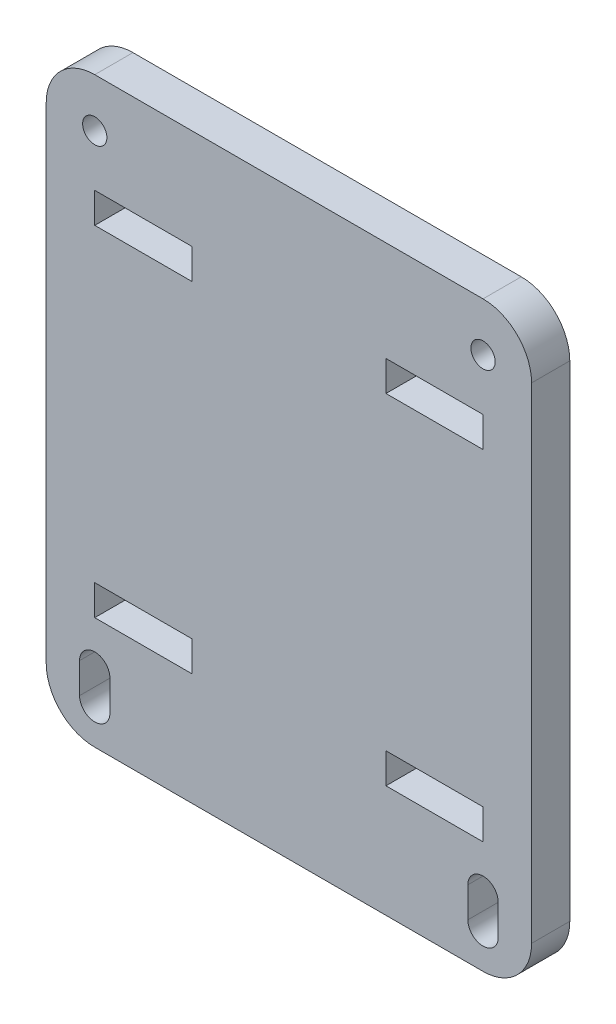
ISO-10303-21;
HEADER;
FILE_DESCRIPTION(('STEP AP214'),'2;1');
FILE_NAME('part.step','',(''),(''),'','','');
FILE_SCHEMA(('AUTOMOTIVE_DESIGN { 1 0 10303 214 1 1 1 1 }'));
ENDSEC;
DATA;
#1=APPLICATION_CONTEXT('core data for automotive mechanical design processes');
#2=APPLICATION_PROTOCOL_DEFINITION('international standard','automotive_design',2000,#1);
#3=PRODUCT_CONTEXT('',#1,'mechanical');
#4=PRODUCT('Part','Part','',(#3));
#5=PRODUCT_RELATED_PRODUCT_CATEGORY('part','',(#4));
#6=PRODUCT_DEFINITION_FORMATION('','',#4);
#7=PRODUCT_DEFINITION_CONTEXT('part definition',#1,'design');
#8=PRODUCT_DEFINITION('design','',#6,#7);
#9=PRODUCT_DEFINITION_SHAPE('','',#8);
#10=(LENGTH_UNIT() NAMED_UNIT(*) SI_UNIT(.MILLI.,.METRE.));
#11=(NAMED_UNIT(*) PLANE_ANGLE_UNIT() SI_UNIT($,.RADIAN.));
#12=(NAMED_UNIT(*) SI_UNIT($,.STERADIAN.) SOLID_ANGLE_UNIT());
#13=UNCERTAINTY_MEASURE_WITH_UNIT(LENGTH_MEASURE(1.E-05),#10,'distance_accuracy_value','');
#14=(GEOMETRIC_REPRESENTATION_CONTEXT(3) GLOBAL_UNCERTAINTY_ASSIGNED_CONTEXT((#13)) GLOBAL_UNIT_ASSIGNED_CONTEXT((#10,
#11,#12)) REPRESENTATION_CONTEXT('',''));
#15=CARTESIAN_POINT('',(0.,0.,0.));
#16=DIRECTION('',(0.,0.,1.));
#17=DIRECTION('',(1.,0.,0.));
#18=AXIS2_PLACEMENT_3D('',#15,#16,#17);
#19=CARTESIAN_POINT('',(-127.,152.4,10.));
#20=DIRECTION('',(1.,0.,0.));
#21=DIRECTION('',(0.,1.,0.));
#22=AXIS2_PLACEMENT_3D('',#19,#20,#21);
#23=PLANE('',#22);
#24=DIRECTION('',(0.,-1.,0.));
#25=VECTOR('',#24,1.);
#26=CARTESIAN_POINT('',(-127.,152.4,0.));
#27=LINE('',#26,#25);
#28=CARTESIAN_POINT('',(-127.,139.7,0.));
#29=VERTEX_POINT('',#28);
#30=CARTESIAN_POINT('',(-127.,12.7,0.));
#31=VERTEX_POINT('',#30);
#32=EDGE_CURVE('E387',#29,#31,#27,.T.);
#33=ORIENTED_EDGE('',*,*,#32,.T.);
#34=DIRECTION('',(0.,0.,-1.));
#35=VECTOR('',#34,1.);
#36=CARTESIAN_POINT('',(-127.,12.7,10.));
#37=LINE('',#36,#35);
#38=CARTESIAN_POINT('',(-127.,12.7,10.));
#39=VERTEX_POINT('',#38);
#40=EDGE_CURVE('E41',#31,#39,#37,.F.);
#41=ORIENTED_EDGE('',*,*,#40,.T.);
#42=DIRECTION('',(0.,-1.,0.));
#43=VECTOR('',#42,1.);
#44=CARTESIAN_POINT('',(-127.,152.4,10.));
#45=LINE('',#44,#43);
#46=CARTESIAN_POINT('',(-127.,139.7,10.));
#47=VERTEX_POINT('',#46);
#48=EDGE_CURVE('E394',#47,#39,#45,.T.);
#49=ORIENTED_EDGE('',*,*,#48,.F.);
#50=DIRECTION('',(0.,0.,-1.));
#51=VECTOR('',#50,1.);
#52=CARTESIAN_POINT('',(-127.,139.7,10.));
#53=LINE('',#52,#51);
#54=EDGE_CURVE('E506',#47,#29,#53,.T.);
#55=ORIENTED_EDGE('',*,*,#54,.T.);
#56=EDGE_LOOP('',(#33,#41,#49,#55));
#57=FACE_BOUND('',#56,.T.);
#58=ADVANCED_FACE('F33',(#57),#23,.F.);
#59=CARTESIAN_POINT('',(-127.,0.,10.));
#60=DIRECTION('',(0.,1.,0.));
#61=DIRECTION('',(0.,0.,1.));
#62=AXIS2_PLACEMENT_3D('',#59,#60,#61);
#63=PLANE('',#62);
#64=DIRECTION('',(1.,0.,0.));
#65=VECTOR('',#64,1.);
#66=CARTESIAN_POINT('',(-127.,0.,0.));
#67=LINE('',#66,#65);
#68=CARTESIAN_POINT('',(-114.3,0.,0.));
#69=VERTEX_POINT('',#68);
#70=CARTESIAN_POINT('',(-12.7,0.,0.));
#71=VERTEX_POINT('',#70);
#72=EDGE_CURVE('E406',#69,#71,#67,.T.);
#73=ORIENTED_EDGE('',*,*,#72,.T.);
#74=DIRECTION('',(0.,0.,-1.));
#75=VECTOR('',#74,1.);
#76=CARTESIAN_POINT('',(-12.7,0.,10.));
#77=LINE('',#76,#75);
#78=CARTESIAN_POINT('',(-12.7,0.,10.));
#79=VERTEX_POINT('',#78);
#80=EDGE_CURVE('E499',#71,#79,#77,.F.);
#81=ORIENTED_EDGE('',*,*,#80,.T.);
#82=DIRECTION('',(1.,0.,0.));
#83=VECTOR('',#82,1.);
#84=CARTESIAN_POINT('',(-127.,0.,10.));
#85=LINE('',#84,#83);
#86=CARTESIAN_POINT('',(-114.3,0.,10.));
#87=VERTEX_POINT('',#86);
#88=EDGE_CURVE('E396',#87,#79,#85,.T.);
#89=ORIENTED_EDGE('',*,*,#88,.F.);
#90=DIRECTION('',(0.,0.,-1.));
#91=VECTOR('',#90,1.);
#92=CARTESIAN_POINT('',(-114.3,0.,10.));
#93=LINE('',#92,#91);
#94=EDGE_CURVE('E496',#87,#69,#93,.T.);
#95=ORIENTED_EDGE('',*,*,#94,.T.);
#96=EDGE_LOOP('',(#73,#81,#89,#95));
#97=FACE_BOUND('',#96,.T.);
#98=ADVANCED_FACE('F522',(#97),#63,.F.);
#99=CARTESIAN_POINT('',(0.,152.4,10.));
#100=DIRECTION('',(-1.,0.,0.));
#101=DIRECTION('',(0.,-1.,0.));
#102=AXIS2_PLACEMENT_3D('',#99,#100,#101);
#103=PLANE('',#102);
#104=DIRECTION('',(0.,1.,0.));
#105=VECTOR('',#104,1.);
#106=CARTESIAN_POINT('',(0.,152.4,10.));
#107=LINE('',#106,#105);
#108=CARTESIAN_POINT('',(0.,12.7,10.));
#109=VERTEX_POINT('',#108);
#110=CARTESIAN_POINT('',(0.,139.7,10.));
#111=VERTEX_POINT('',#110);
#112=EDGE_CURVE('E400',#109,#111,#107,.T.);
#113=ORIENTED_EDGE('',*,*,#112,.F.);
#114=DIRECTION('',(0.,0.,-1.));
#115=VECTOR('',#114,1.);
#116=CARTESIAN_POINT('',(0.,12.7,10.));
#117=LINE('',#116,#115);
#118=CARTESIAN_POINT('',(0.,12.7,0.));
#119=VERTEX_POINT('',#118);
#120=EDGE_CURVE('E487',#109,#119,#117,.T.);
#121=ORIENTED_EDGE('',*,*,#120,.T.);
#122=DIRECTION('',(0.,1.,0.));
#123=VECTOR('',#122,1.);
#124=CARTESIAN_POINT('',(0.,152.4,0.));
#125=LINE('',#124,#123);
#126=CARTESIAN_POINT('',(0.,139.7,0.));
#127=VERTEX_POINT('',#126);
#128=EDGE_CURVE('E409',#119,#127,#125,.T.);
#129=ORIENTED_EDGE('',*,*,#128,.T.);
#130=DIRECTION('',(0.,0.,-1.));
#131=VECTOR('',#130,1.);
#132=CARTESIAN_POINT('',(0.,139.7,10.));
#133=LINE('',#132,#131);
#134=EDGE_CURVE('E482',#127,#111,#133,.F.);
#135=ORIENTED_EDGE('',*,*,#134,.T.);
#136=EDGE_LOOP('',(#113,#121,#129,#135));
#137=FACE_BOUND('',#136,.T.);
#138=ADVANCED_FACE('F532',(#137),#103,.F.);
#139=CARTESIAN_POINT('',(-127.,152.4,10.));
#140=DIRECTION('',(0.,-1.,0.));
#141=DIRECTION('',(0.,0.,-1.));
#142=AXIS2_PLACEMENT_3D('',#139,#140,#141);
#143=PLANE('',#142);
#144=DIRECTION('',(-1.,0.,0.));
#145=VECTOR('',#144,1.);
#146=CARTESIAN_POINT('',(-127.,152.4,0.));
#147=LINE('',#146,#145);
#148=CARTESIAN_POINT('',(-12.7,152.4,0.));
#149=VERTEX_POINT('',#148);
#150=CARTESIAN_POINT('',(-114.3,152.4,0.));
#151=VERTEX_POINT('',#150);
#152=EDGE_CURVE('E397',#149,#151,#147,.T.);
#153=ORIENTED_EDGE('',*,*,#152,.T.);
#154=DIRECTION('',(0.,0.,-1.));
#155=VECTOR('',#154,1.);
#156=CARTESIAN_POINT('',(-114.3,152.4,10.));
#157=LINE('',#156,#155);
#158=CARTESIAN_POINT('',(-114.3,152.4,10.));
#159=VERTEX_POINT('',#158);
#160=EDGE_CURVE('E11',#151,#159,#157,.F.);
#161=ORIENTED_EDGE('',*,*,#160,.T.);
#162=DIRECTION('',(-1.,0.,0.));
#163=VECTOR('',#162,1.);
#164=CARTESIAN_POINT('',(-127.,152.4,10.));
#165=LINE('',#164,#163);
#166=CARTESIAN_POINT('',(-12.7,152.4,10.));
#167=VERTEX_POINT('',#166);
#168=EDGE_CURVE('E402',#167,#159,#165,.T.);
#169=ORIENTED_EDGE('',*,*,#168,.F.);
#170=DIRECTION('',(0.,0.,-1.));
#171=VECTOR('',#170,1.);
#172=CARTESIAN_POINT('',(-12.7,152.4,10.));
#173=LINE('',#172,#171);
#174=EDGE_CURVE('E476',#167,#149,#173,.T.);
#175=ORIENTED_EDGE('',*,*,#174,.T.);
#176=EDGE_LOOP('',(#153,#161,#169,#175));
#177=FACE_BOUND('',#176,.T.);
#178=ADVANCED_FACE('F540',(#177),#143,.F.);
#179=CARTESIAN_POINT('',(-127.,0.,10.));
#180=DIRECTION('',(0.,0.,1.));
#181=DIRECTION('',(1.,0.,0.));
#182=AXIS2_PLACEMENT_3D('',#179,#180,#181);
#183=PLANE('',#182);
#184=CARTESIAN_POINT('',(-12.7,17.6403,10.));
#185=DIRECTION('',(0.,0.,1.));
#186=DIRECTION('',(1.,0.,0.));
#187=AXIS2_PLACEMENT_3D('',#184,#185,#186);
#188=CIRCLE('',#187,3.97002);
#189=CARTESIAN_POINT('',(-8.72998000000003,17.6403,10.));
#190=VERTEX_POINT('',#189);
#191=CARTESIAN_POINT('',(-16.67002,17.6403,10.));
#192=VERTEX_POINT('',#191);
#193=EDGE_CURVE('E249',#190,#192,#188,.T.);
#194=ORIENTED_EDGE('',*,*,#193,.F.);
#195=DIRECTION('',(0.,1.,0.));
#196=VECTOR('',#195,1.);
#197=CARTESIAN_POINT('',(-8.72998000000003,17.6403,10.));
#198=LINE('',#197,#196);
#199=CARTESIAN_POINT('',(-8.72998000000003,9.7028,10.));
#200=VERTEX_POINT('',#199);
#201=EDGE_CURVE('E267',#200,#190,#198,.T.);
#202=ORIENTED_EDGE('',*,*,#201,.F.);
#203=CARTESIAN_POINT('',(-12.7,9.7028,10.));
#204=DIRECTION('',(0.,0.,1.));
#205=DIRECTION('',(1.,0.,0.));
#206=AXIS2_PLACEMENT_3D('',#203,#204,#205);
#207=CIRCLE('',#206,3.97002);
#208=CARTESIAN_POINT('',(-16.67002,9.7028,10.));
#209=VERTEX_POINT('',#208);
#210=EDGE_CURVE('E270',#209,#200,#207,.T.);
#211=ORIENTED_EDGE('',*,*,#210,.F.);
#212=DIRECTION('',(0.,-1.,0.));
#213=VECTOR('',#212,1.);
#214=CARTESIAN_POINT('',(-16.67002,17.6403,10.));
#215=LINE('',#214,#213);
#216=EDGE_CURVE('E276',#192,#209,#215,.T.);
#217=ORIENTED_EDGE('',*,*,#216,.F.);
#218=EDGE_LOOP('',(#194,#202,#211,#217));
#219=FACE_BOUND('',#218,.T.);
#220=CARTESIAN_POINT('',(-114.3,17.6403,10.));
#221=DIRECTION('',(0.,0.,1.));
#222=DIRECTION('',(1.,0.,0.));
#223=AXIS2_PLACEMENT_3D('',#220,#221,#222);
#224=CIRCLE('',#223,3.97002);
#225=CARTESIAN_POINT('',(-110.32998,17.6403,10.));
#226=VERTEX_POINT('',#225);
#227=CARTESIAN_POINT('',(-118.27002,17.6403,10.));
#228=VERTEX_POINT('',#227);
#229=EDGE_CURVE('E282',#226,#228,#224,.T.);
#230=ORIENTED_EDGE('',*,*,#229,.F.);
#231=DIRECTION('',(0.,1.,0.));
#232=VECTOR('',#231,1.);
#233=CARTESIAN_POINT('',(-110.32998,17.6403,10.));
#234=LINE('',#233,#232);
#235=CARTESIAN_POINT('',(-110.32998,9.7028,10.));
#236=VERTEX_POINT('',#235);
#237=EDGE_CURVE('E290',#236,#226,#234,.T.);
#238=ORIENTED_EDGE('',*,*,#237,.F.);
#239=CARTESIAN_POINT('',(-114.3,9.7028,10.));
#240=DIRECTION('',(0.,0.,1.));
#241=DIRECTION('',(1.,0.,0.));
#242=AXIS2_PLACEMENT_3D('',#239,#240,#241);
#243=CIRCLE('',#242,3.97002);
#244=CARTESIAN_POINT('',(-118.27002,9.7028,10.));
#245=VERTEX_POINT('',#244);
#246=EDGE_CURVE('E304',#245,#236,#243,.T.);
#247=ORIENTED_EDGE('',*,*,#246,.F.);
#248=DIRECTION('',(0.,-1.,0.));
#249=VECTOR('',#248,1.);
#250=CARTESIAN_POINT('',(-118.27002,17.6403,10.));
#251=LINE('',#250,#249);
#252=EDGE_CURVE('E301',#228,#245,#251,.T.);
#253=ORIENTED_EDGE('',*,*,#252,.F.);
#254=EDGE_LOOP('',(#230,#238,#247,#253));
#255=FACE_BOUND('',#254,.T.);
#256=CARTESIAN_POINT('',(-12.7,139.7,10.));
#257=DIRECTION('',(0.,0.,1.));
#258=DIRECTION('',(1.,0.,0.));
#259=AXIS2_PLACEMENT_3D('',#256,#257,#258);
#260=CIRCLE('',#259,3.175);
#261=CARTESIAN_POINT('',(-9.52500000000003,139.7,10.));
#262=VERTEX_POINT('',#261);
#263=EDGE_CURVE('E311',#262,#262,#260,.T.);
#264=ORIENTED_EDGE('',*,*,#263,.F.);
#265=EDGE_LOOP('',(#264));
#266=FACE_BOUND('',#265,.T.);
#267=CARTESIAN_POINT('',(-114.3,139.7,10.));
#268=DIRECTION('',(0.,0.,1.));
#269=DIRECTION('',(1.,0.,0.));
#270=AXIS2_PLACEMENT_3D('',#267,#268,#269);
#271=CIRCLE('',#270,3.175);
#272=CARTESIAN_POINT('',(-111.125,139.7,10.));
#273=VERTEX_POINT('',#272);
#274=EDGE_CURVE('E321',#273,#273,#271,.T.);
#275=ORIENTED_EDGE('',*,*,#274,.F.);
#276=EDGE_LOOP('',(#275));
#277=FACE_BOUND('',#276,.T.);
#278=DIRECTION('',(0.,-1.,0.));
#279=VECTOR('',#278,1.);
#280=CARTESIAN_POINT('',(-38.1,126.19228,10.));
#281=LINE('',#280,#279);
#282=CARTESIAN_POINT('',(-38.1,126.19228,10.));
#283=VERTEX_POINT('',#282);
#284=CARTESIAN_POINT('',(-38.1,118.25478,10.));
#285=VERTEX_POINT('',#284);
#286=EDGE_CURVE('E356',#283,#285,#281,.T.);
#287=ORIENTED_EDGE('',*,*,#286,.F.);
#288=DIRECTION('',(-1.,0.,0.));
#289=VECTOR('',#288,1.);
#290=CARTESIAN_POINT('',(-38.1,126.19228,10.));
#291=LINE('',#290,#289);
#292=CARTESIAN_POINT('',(-12.7,126.19228,10.));
#293=VERTEX_POINT('',#292);
#294=EDGE_CURVE('E348',#293,#283,#291,.T.);
#295=ORIENTED_EDGE('',*,*,#294,.F.);
#296=DIRECTION('',(0.,1.,0.));
#297=VECTOR('',#296,1.);
#298=CARTESIAN_POINT('',(-12.7,126.19228,10.));
#299=LINE('',#298,#297);
#300=CARTESIAN_POINT('',(-12.7,118.25478,10.));
#301=VERTEX_POINT('',#300);
#302=EDGE_CURVE('E340',#301,#293,#299,.T.);
#303=ORIENTED_EDGE('',*,*,#302,.F.);
#304=DIRECTION('',(1.,0.,0.));
#305=VECTOR('',#304,1.);
#306=CARTESIAN_POINT('',(-38.1,118.25478,10.));
#307=LINE('',#306,#305);
#308=EDGE_CURVE('E327',#285,#301,#307,.T.);
#309=ORIENTED_EDGE('',*,*,#308,.F.);
#310=EDGE_LOOP('',(#287,#295,#303,#309));
#311=FACE_BOUND('',#310,.T.);
#312=DIRECTION('',(0.,-1.,0.));
#313=VECTOR('',#312,1.);
#314=CARTESIAN_POINT('',(-114.3,126.19228,10.));
#315=LINE('',#314,#313);
#316=CARTESIAN_POINT('',(-114.3,126.19228,10.));
#317=VERTEX_POINT('',#316);
#318=CARTESIAN_POINT('',(-114.3,118.25478,10.));
#319=VERTEX_POINT('',#318);
#320=EDGE_CURVE('E361',#317,#319,#315,.T.);
#321=ORIENTED_EDGE('',*,*,#320,.F.);
#322=DIRECTION('',(-1.,0.,0.));
#323=VECTOR('',#322,1.);
#324=CARTESIAN_POINT('',(-114.3,126.19228,10.));
#325=LINE('',#324,#323);
#326=CARTESIAN_POINT('',(-88.9,126.19228,10.));
#327=VERTEX_POINT('',#326);
#328=EDGE_CURVE('E366',#327,#317,#325,.T.);
#329=ORIENTED_EDGE('',*,*,#328,.F.);
#330=DIRECTION('',(0.,1.,0.));
#331=VECTOR('',#330,1.);
#332=CARTESIAN_POINT('',(-88.9,126.19228,10.));
#333=LINE('',#332,#331);
#334=CARTESIAN_POINT('',(-88.9,118.25478,10.));
#335=VERTEX_POINT('',#334);
#336=EDGE_CURVE('E380',#335,#327,#333,.T.);
#337=ORIENTED_EDGE('',*,*,#336,.F.);
#338=DIRECTION('',(1.,0.,0.));
#339=VECTOR('',#338,1.);
#340=CARTESIAN_POINT('',(-114.3,118.25478,10.));
#341=LINE('',#340,#339);
#342=EDGE_CURVE('E377',#319,#335,#341,.T.);
#343=ORIENTED_EDGE('',*,*,#342,.F.);
#344=EDGE_LOOP('',(#321,#329,#337,#343));
#345=FACE_BOUND('',#344,.T.);
#346=ORIENTED_EDGE('',*,*,#88,.T.);
#347=CARTESIAN_POINT('',(-12.7,12.7,10.));
#348=DIRECTION('',(0.,0.,1.));
#349=DIRECTION('',(1.,0.,0.));
#350=AXIS2_PLACEMENT_3D('',#347,#348,#349);
#351=CIRCLE('',#350,12.7);
#352=EDGE_CURVE('E504',#79,#109,#351,.T.);
#353=ORIENTED_EDGE('',*,*,#352,.T.);
#354=ORIENTED_EDGE('',*,*,#112,.T.);
#355=CARTESIAN_POINT('',(-12.7,139.7,10.));
#356=DIRECTION('',(0.,0.,1.));
#357=DIRECTION('',(1.,0.,0.));
#358=AXIS2_PLACEMENT_3D('',#355,#356,#357);
#359=CIRCLE('',#358,12.7);
#360=EDGE_CURVE('E485',#111,#167,#359,.T.);
#361=ORIENTED_EDGE('',*,*,#360,.T.);
#362=ORIENTED_EDGE('',*,*,#168,.T.);
#363=CARTESIAN_POINT('',(-114.3,139.7,10.));
#364=DIRECTION('',(0.,0.,1.));
#365=DIRECTION('',(1.,0.,0.));
#366=AXIS2_PLACEMENT_3D('',#363,#364,#365);
#367=CIRCLE('',#366,12.7);
#368=EDGE_CURVE('E54',#159,#47,#367,.T.);
#369=ORIENTED_EDGE('',*,*,#368,.T.);
#370=ORIENTED_EDGE('',*,*,#48,.T.);
#371=CARTESIAN_POINT('',(-114.3,12.7,10.));
#372=DIRECTION('',(0.,0.,1.));
#373=DIRECTION('',(1.,0.,0.));
#374=AXIS2_PLACEMENT_3D('',#371,#372,#373);
#375=CIRCLE('',#374,12.7);
#376=EDGE_CURVE('E502',#39,#87,#375,.T.);
#377=ORIENTED_EDGE('',*,*,#376,.T.);
#378=EDGE_LOOP('',(#346,#353,#354,#361,#362,#369,#370,#377));
#379=FACE_BOUND('',#378,.T.);
#380=DIRECTION('',(0.,-1.,0.));
#381=VECTOR('',#380,1.);
#382=CARTESIAN_POINT('',(-114.3,37.29228,10.));
#383=LINE('',#382,#381);
#384=CARTESIAN_POINT('',(-114.3,37.29228,10.));
#385=VERTEX_POINT('',#384);
#386=CARTESIAN_POINT('',(-114.3,29.35478,10.));
#387=VERTEX_POINT('',#386);
#388=EDGE_CURVE('E404',#385,#387,#383,.T.);
#389=ORIENTED_EDGE('',*,*,#388,.F.);
#390=DIRECTION('',(-1.,0.,0.));
#391=VECTOR('',#390,1.);
#392=CARTESIAN_POINT('',(-114.3,37.29228,10.));
#393=LINE('',#392,#391);
#394=CARTESIAN_POINT('',(-88.9,37.29228,10.));
#395=VERTEX_POINT('',#394);
#396=EDGE_CURVE('E414',#395,#385,#393,.T.);
#397=ORIENTED_EDGE('',*,*,#396,.F.);
#398=DIRECTION('',(0.,1.,0.));
#399=VECTOR('',#398,1.);
#400=CARTESIAN_POINT('',(-88.9,37.29228,10.));
#401=LINE('',#400,#399);
#402=CARTESIAN_POINT('',(-88.9,29.35478,10.));
#403=VERTEX_POINT('',#402);
#404=EDGE_CURVE('E417',#403,#395,#401,.T.);
#405=ORIENTED_EDGE('',*,*,#404,.F.);
#406=DIRECTION('',(1.,0.,0.));
#407=VECTOR('',#406,1.);
#408=CARTESIAN_POINT('',(-114.3,29.35478,10.));
#409=LINE('',#408,#407);
#410=EDGE_CURVE('E420',#387,#403,#409,.T.);
#411=ORIENTED_EDGE('',*,*,#410,.F.);
#412=EDGE_LOOP('',(#389,#397,#405,#411));
#413=FACE_BOUND('',#412,.T.);
#414=DIRECTION('',(0.,-1.,0.));
#415=VECTOR('',#414,1.);
#416=CARTESIAN_POINT('',(-38.1,37.29228,10.));
#417=LINE('',#416,#415);
#418=CARTESIAN_POINT('',(-38.1,37.29228,10.));
#419=VERTEX_POINT('',#418);
#420=CARTESIAN_POINT('',(-38.1,29.35478,10.));
#421=VERTEX_POINT('',#420);
#422=EDGE_CURVE('E444',#419,#421,#417,.T.);
#423=ORIENTED_EDGE('',*,*,#422,.F.);
#424=DIRECTION('',(-1.,0.,0.));
#425=VECTOR('',#424,1.);
#426=CARTESIAN_POINT('',(-38.1,37.29228,10.));
#427=LINE('',#426,#425);
#428=CARTESIAN_POINT('',(-12.7,37.29228,10.));
#429=VERTEX_POINT('',#428);
#430=EDGE_CURVE('E446',#429,#419,#427,.T.);
#431=ORIENTED_EDGE('',*,*,#430,.F.);
#432=DIRECTION('',(0.,1.,0.));
#433=VECTOR('',#432,1.);
#434=CARTESIAN_POINT('',(-12.7,37.29228,10.));
#435=LINE('',#434,#433);
#436=CARTESIAN_POINT('',(-12.7,29.35478,10.));
#437=VERTEX_POINT('',#436);
#438=EDGE_CURVE('E449',#437,#429,#435,.T.);
#439=ORIENTED_EDGE('',*,*,#438,.F.);
#440=DIRECTION('',(1.,0.,0.));
#441=VECTOR('',#440,1.);
#442=CARTESIAN_POINT('',(-38.1,29.35478,10.));
#443=LINE('',#442,#441);
#444=EDGE_CURVE('E452',#421,#437,#443,.T.);
#445=ORIENTED_EDGE('',*,*,#444,.F.);
#446=EDGE_LOOP('',(#423,#431,#439,#445));
#447=FACE_BOUND('',#446,.T.);
#448=ADVANCED_FACE('F525',(#219,#255,#266,#277,#311,#345,#379,#413,#447),#183,.T.);
#449=CARTESIAN_POINT('',(-127.,0.,0.));
#450=DIRECTION('',(0.,0.,1.));
#451=DIRECTION('',(1.,0.,0.));
#452=AXIS2_PLACEMENT_3D('',#449,#450,#451);
#453=PLANE('',#452);
#454=DIRECTION('',(0.,1.,0.));
#455=VECTOR('',#454,1.);
#456=CARTESIAN_POINT('',(-8.72998000000003,17.6403,0.));
#457=LINE('',#456,#455);
#458=CARTESIAN_POINT('',(-8.72998000000003,9.7028,0.));
#459=VERTEX_POINT('',#458);
#460=CARTESIAN_POINT('',(-8.72998000000003,17.6403,0.));
#461=VERTEX_POINT('',#460);
#462=EDGE_CURVE('E254',#459,#461,#457,.T.);
#463=ORIENTED_EDGE('',*,*,#462,.T.);
#464=CARTESIAN_POINT('',(-12.7,17.6403,0.));
#465=DIRECTION('',(0.,0.,1.));
#466=DIRECTION('',(1.,0.,0.));
#467=AXIS2_PLACEMENT_3D('',#464,#465,#466);
#468=CIRCLE('',#467,3.97002);
#469=CARTESIAN_POINT('',(-16.67002,17.6403,0.));
#470=VERTEX_POINT('',#469);
#471=EDGE_CURVE('E246',#461,#470,#468,.T.);
#472=ORIENTED_EDGE('',*,*,#471,.T.);
#473=DIRECTION('',(0.,-1.,0.));
#474=VECTOR('',#473,1.);
#475=CARTESIAN_POINT('',(-16.67002,17.6403,0.));
#476=LINE('',#475,#474);
#477=CARTESIAN_POINT('',(-16.67002,9.7028,0.));
#478=VERTEX_POINT('',#477);
#479=EDGE_CURVE('E258',#470,#478,#476,.T.);
#480=ORIENTED_EDGE('',*,*,#479,.T.);
#481=CARTESIAN_POINT('',(-12.7,9.7028,0.));
#482=DIRECTION('',(0.,0.,1.));
#483=DIRECTION('',(1.,0.,0.));
#484=AXIS2_PLACEMENT_3D('',#481,#482,#483);
#485=CIRCLE('',#484,3.97002);
#486=EDGE_CURVE('E262',#478,#459,#485,.T.);
#487=ORIENTED_EDGE('',*,*,#486,.T.);
#488=EDGE_LOOP('',(#463,#472,#480,#487));
#489=FACE_BOUND('',#488,.T.);
#490=DIRECTION('',(0.,1.,0.));
#491=VECTOR('',#490,1.);
#492=CARTESIAN_POINT('',(-110.32998,17.6403,0.));
#493=LINE('',#492,#491);
#494=CARTESIAN_POINT('',(-110.32998,9.7028,0.));
#495=VERTEX_POINT('',#494);
#496=CARTESIAN_POINT('',(-110.32998,17.6403,0.));
#497=VERTEX_POINT('',#496);
#498=EDGE_CURVE('E296',#495,#497,#493,.T.);
#499=ORIENTED_EDGE('',*,*,#498,.T.);
#500=CARTESIAN_POINT('',(-114.3,17.6403,0.));
#501=DIRECTION('',(0.,0.,1.));
#502=DIRECTION('',(1.,0.,0.));
#503=AXIS2_PLACEMENT_3D('',#500,#501,#502);
#504=CIRCLE('',#503,3.97002);
#505=CARTESIAN_POINT('',(-118.27002,17.6403,0.));
#506=VERTEX_POINT('',#505);
#507=EDGE_CURVE('E286',#497,#506,#504,.T.);
#508=ORIENTED_EDGE('',*,*,#507,.T.);
#509=DIRECTION('',(0.,-1.,0.));
#510=VECTOR('',#509,1.);
#511=CARTESIAN_POINT('',(-118.27002,17.6403,0.));
#512=LINE('',#511,#510);
#513=CARTESIAN_POINT('',(-118.27002,9.7028,0.));
#514=VERTEX_POINT('',#513);
#515=EDGE_CURVE('E289',#506,#514,#512,.T.);
#516=ORIENTED_EDGE('',*,*,#515,.T.);
#517=CARTESIAN_POINT('',(-114.3,9.7028,0.));
#518=DIRECTION('',(0.,0.,1.));
#519=DIRECTION('',(1.,0.,0.));
#520=AXIS2_PLACEMENT_3D('',#517,#518,#519);
#521=CIRCLE('',#520,3.97002);
#522=EDGE_CURVE('E293',#514,#495,#521,.T.);
#523=ORIENTED_EDGE('',*,*,#522,.T.);
#524=EDGE_LOOP('',(#499,#508,#516,#523));
#525=FACE_BOUND('',#524,.T.);
#526=CARTESIAN_POINT('',(-12.7,139.7,0.));
#527=DIRECTION('',(0.,0.,1.));
#528=DIRECTION('',(1.,0.,0.));
#529=AXIS2_PLACEMENT_3D('',#526,#527,#528);
#530=CIRCLE('',#529,3.175);
#531=CARTESIAN_POINT('',(-9.52500000000003,139.7,0.));
#532=VERTEX_POINT('',#531);
#533=EDGE_CURVE('E318',#532,#532,#530,.T.);
#534=ORIENTED_EDGE('',*,*,#533,.T.);
#535=EDGE_LOOP('',(#534));
#536=FACE_BOUND('',#535,.T.);
#537=CARTESIAN_POINT('',(-114.3,139.7,0.));
#538=DIRECTION('',(0.,0.,1.));
#539=DIRECTION('',(1.,0.,0.));
#540=AXIS2_PLACEMENT_3D('',#537,#538,#539);
#541=CIRCLE('',#540,3.175);
#542=CARTESIAN_POINT('',(-111.125,139.7,0.));
#543=VERTEX_POINT('',#542);
#544=EDGE_CURVE('E324',#543,#543,#541,.T.);
#545=ORIENTED_EDGE('',*,*,#544,.T.);
#546=EDGE_LOOP('',(#545));
#547=FACE_BOUND('',#546,.T.);
#548=DIRECTION('',(-1.,0.,0.));
#549=VECTOR('',#548,1.);
#550=CARTESIAN_POINT('',(-38.1,126.19228,0.));
#551=LINE('',#550,#549);
#552=CARTESIAN_POINT('',(-12.7,126.19228,0.));
#553=VERTEX_POINT('',#552);
#554=CARTESIAN_POINT('',(-38.1,126.19228,0.));
#555=VERTEX_POINT('',#554);
#556=EDGE_CURVE('E353',#553,#555,#551,.T.);
#557=ORIENTED_EDGE('',*,*,#556,.T.);
#558=DIRECTION('',(0.,-1.,0.));
#559=VECTOR('',#558,1.);
#560=CARTESIAN_POINT('',(-38.1,126.19228,0.));
#561=LINE('',#560,#559);
#562=CARTESIAN_POINT('',(-38.1,118.25478,0.));
#563=VERTEX_POINT('',#562);
#564=EDGE_CURVE('E358',#555,#563,#561,.T.);
#565=ORIENTED_EDGE('',*,*,#564,.T.);
#566=DIRECTION('',(1.,0.,0.));
#567=VECTOR('',#566,1.);
#568=CARTESIAN_POINT('',(-38.1,118.25478,0.));
#569=LINE('',#568,#567);
#570=CARTESIAN_POINT('',(-12.7,118.25478,0.));
#571=VERTEX_POINT('',#570);
#572=EDGE_CURVE('E331',#563,#571,#569,.T.);
#573=ORIENTED_EDGE('',*,*,#572,.T.);
#574=DIRECTION('',(0.,1.,0.));
#575=VECTOR('',#574,1.);
#576=CARTESIAN_POINT('',(-12.7,126.19228,0.));
#577=LINE('',#576,#575);
#578=EDGE_CURVE('E345',#571,#553,#577,.T.);
#579=ORIENTED_EDGE('',*,*,#578,.T.);
#580=EDGE_LOOP('',(#557,#565,#573,#579));
#581=FACE_BOUND('',#580,.T.);
#582=DIRECTION('',(-1.,0.,0.));
#583=VECTOR('',#582,1.);
#584=CARTESIAN_POINT('',(-114.3,126.19228,0.));
#585=LINE('',#584,#583);
#586=CARTESIAN_POINT('',(-88.9,126.19228,0.));
#587=VERTEX_POINT('',#586);
#588=CARTESIAN_POINT('',(-114.3,126.19228,0.));
#589=VERTEX_POINT('',#588);
#590=EDGE_CURVE('E372',#587,#589,#585,.T.);
#591=ORIENTED_EDGE('',*,*,#590,.T.);
#592=DIRECTION('',(0.,-1.,0.));
#593=VECTOR('',#592,1.);
#594=CARTESIAN_POINT('',(-114.3,126.19228,0.));
#595=LINE('',#594,#593);
#596=CARTESIAN_POINT('',(-114.3,118.25478,0.));
#597=VERTEX_POINT('',#596);
#598=EDGE_CURVE('E362',#589,#597,#595,.T.);
#599=ORIENTED_EDGE('',*,*,#598,.T.);
#600=DIRECTION('',(1.,0.,0.));
#601=VECTOR('',#600,1.);
#602=CARTESIAN_POINT('',(-114.3,118.25478,0.));
#603=LINE('',#602,#601);
#604=CARTESIAN_POINT('',(-88.9,118.25478,0.));
#605=VERTEX_POINT('',#604);
#606=EDGE_CURVE('E365',#597,#605,#603,.T.);
#607=ORIENTED_EDGE('',*,*,#606,.T.);
#608=DIRECTION('',(0.,1.,0.));
#609=VECTOR('',#608,1.);
#610=CARTESIAN_POINT('',(-88.9,126.19228,0.));
#611=LINE('',#610,#609);
#612=EDGE_CURVE('E369',#605,#587,#611,.T.);
#613=ORIENTED_EDGE('',*,*,#612,.T.);
#614=EDGE_LOOP('',(#591,#599,#607,#613));
#615=FACE_BOUND('',#614,.T.);
#616=ORIENTED_EDGE('',*,*,#128,.F.);
#617=CARTESIAN_POINT('',(-12.7,12.7,0.));
#618=DIRECTION('',(0.,0.,1.));
#619=DIRECTION('',(1.,0.,0.));
#620=AXIS2_PLACEMENT_3D('',#617,#618,#619);
#621=CIRCLE('',#620,12.7);
#622=EDGE_CURVE('E494',#119,#71,#621,.F.);
#623=ORIENTED_EDGE('',*,*,#622,.T.);
#624=ORIENTED_EDGE('',*,*,#72,.F.);
#625=CARTESIAN_POINT('',(-114.3,12.7,0.));
#626=DIRECTION('',(0.,0.,1.));
#627=DIRECTION('',(1.,0.,0.));
#628=AXIS2_PLACEMENT_3D('',#625,#626,#627);
#629=CIRCLE('',#628,12.7);
#630=EDGE_CURVE('E492',#69,#31,#629,.F.);
#631=ORIENTED_EDGE('',*,*,#630,.T.);
#632=ORIENTED_EDGE('',*,*,#32,.F.);
#633=CARTESIAN_POINT('',(-114.3,139.7,0.));
#634=DIRECTION('',(0.,0.,1.));
#635=DIRECTION('',(1.,0.,0.));
#636=AXIS2_PLACEMENT_3D('',#633,#634,#635);
#637=CIRCLE('',#636,12.7);
#638=EDGE_CURVE('E490',#29,#151,#637,.F.);
#639=ORIENTED_EDGE('',*,*,#638,.T.);
#640=ORIENTED_EDGE('',*,*,#152,.F.);
#641=CARTESIAN_POINT('',(-12.7,139.7,0.));
#642=DIRECTION('',(0.,0.,1.));
#643=DIRECTION('',(1.,0.,0.));
#644=AXIS2_PLACEMENT_3D('',#641,#642,#643);
#645=CIRCLE('',#644,12.7);
#646=EDGE_CURVE('E479',#149,#127,#645,.F.);
#647=ORIENTED_EDGE('',*,*,#646,.T.);
#648=EDGE_LOOP('',(#616,#623,#624,#631,#632,#639,#640,#647));
#649=FACE_BOUND('',#648,.T.);
#650=DIRECTION('',(0.,-1.,0.));
#651=VECTOR('',#650,1.);
#652=CARTESIAN_POINT('',(-114.3,37.29228,0.));
#653=LINE('',#652,#651);
#654=CARTESIAN_POINT('',(-114.3,37.29228,0.));
#655=VERTEX_POINT('',#654);
#656=CARTESIAN_POINT('',(-114.3,29.35478,0.));
#657=VERTEX_POINT('',#656);
#658=EDGE_CURVE('E423',#655,#657,#653,.T.);
#659=ORIENTED_EDGE('',*,*,#658,.T.);
#660=DIRECTION('',(1.,0.,0.));
#661=VECTOR('',#660,1.);
#662=CARTESIAN_POINT('',(-114.3,29.35478,0.));
#663=LINE('',#662,#661);
#664=CARTESIAN_POINT('',(-88.9,29.35478,0.));
#665=VERTEX_POINT('',#664);
#666=EDGE_CURVE('E425',#657,#665,#663,.T.);
#667=ORIENTED_EDGE('',*,*,#666,.T.);
#668=DIRECTION('',(0.,1.,0.));
#669=VECTOR('',#668,1.);
#670=CARTESIAN_POINT('',(-88.9,37.29228,0.));
#671=LINE('',#670,#669);
#672=CARTESIAN_POINT('',(-88.9,37.29228,0.));
#673=VERTEX_POINT('',#672);
#674=EDGE_CURVE('E427',#665,#673,#671,.T.);
#675=ORIENTED_EDGE('',*,*,#674,.T.);
#676=DIRECTION('',(-1.,0.,0.));
#677=VECTOR('',#676,1.);
#678=CARTESIAN_POINT('',(-114.3,37.29228,0.));
#679=LINE('',#678,#677);
#680=EDGE_CURVE('E429',#673,#655,#679,.T.);
#681=ORIENTED_EDGE('',*,*,#680,.T.);
#682=EDGE_LOOP('',(#659,#667,#675,#681));
#683=FACE_BOUND('',#682,.T.);
#684=DIRECTION('',(0.,-1.,0.));
#685=VECTOR('',#684,1.);
#686=CARTESIAN_POINT('',(-38.1,37.29228,0.));
#687=LINE('',#686,#685);
#688=CARTESIAN_POINT('',(-38.1,37.29228,0.));
#689=VERTEX_POINT('',#688);
#690=CARTESIAN_POINT('',(-38.1,29.35478,0.));
#691=VERTEX_POINT('',#690);
#692=EDGE_CURVE('E455',#689,#691,#687,.T.);
#693=ORIENTED_EDGE('',*,*,#692,.T.);
#694=DIRECTION('',(1.,0.,0.));
#695=VECTOR('',#694,1.);
#696=CARTESIAN_POINT('',(-38.1,29.35478,0.));
#697=LINE('',#696,#695);
#698=CARTESIAN_POINT('',(-12.7,29.35478,0.));
#699=VERTEX_POINT('',#698);
#700=EDGE_CURVE('E457',#691,#699,#697,.T.);
#701=ORIENTED_EDGE('',*,*,#700,.T.);
#702=DIRECTION('',(0.,1.,0.));
#703=VECTOR('',#702,1.);
#704=CARTESIAN_POINT('',(-12.7,37.29228,0.));
#705=LINE('',#704,#703);
#706=CARTESIAN_POINT('',(-12.7,37.29228,0.));
#707=VERTEX_POINT('',#706);
#708=EDGE_CURVE('E459',#699,#707,#705,.T.);
#709=ORIENTED_EDGE('',*,*,#708,.T.);
#710=DIRECTION('',(-1.,0.,0.));
#711=VECTOR('',#710,1.);
#712=CARTESIAN_POINT('',(-38.1,37.29228,0.));
#713=LINE('',#712,#711);
#714=EDGE_CURVE('E461',#707,#689,#713,.T.);
#715=ORIENTED_EDGE('',*,*,#714,.T.);
#716=EDGE_LOOP('',(#693,#701,#709,#715));
#717=FACE_BOUND('',#716,.T.);
#718=ADVANCED_FACE('F264',(#489,#525,#536,#547,#581,#615,#649,#683,#717),#453,.F.);
#719=CARTESIAN_POINT('',(-114.3,126.19228,0.));
#720=DIRECTION('',(-1.,0.,0.));
#721=DIRECTION('',(0.,0.,1.));
#722=AXIS2_PLACEMENT_3D('',#719,#720,#721);
#723=PLANE('',#722);
#724=ORIENTED_EDGE('',*,*,#320,.T.);
#725=DIRECTION('',(0.,0.,1.));
#726=VECTOR('',#725,1.);
#727=CARTESIAN_POINT('',(-114.3,118.25478,0.));
#728=LINE('',#727,#726);
#729=EDGE_CURVE('E375',#597,#319,#728,.T.);
#730=ORIENTED_EDGE('',*,*,#729,.F.);
#731=ORIENTED_EDGE('',*,*,#598,.F.);
#732=DIRECTION('',(0.,0.,1.));
#733=VECTOR('',#732,1.);
#734=CARTESIAN_POINT('',(-114.3,126.19228,0.));
#735=LINE('',#734,#733);
#736=EDGE_CURVE('E385',#589,#317,#735,.T.);
#737=ORIENTED_EDGE('',*,*,#736,.T.);
#738=EDGE_LOOP('',(#724,#730,#731,#737));
#739=FACE_BOUND('',#738,.T.);
#740=ADVANCED_FACE('F799',(#739),#723,.F.);
#741=CARTESIAN_POINT('',(-114.3,126.19228,0.));
#742=DIRECTION('',(0.,1.,0.));
#743=DIRECTION('',(0.,0.,1.));
#744=AXIS2_PLACEMENT_3D('',#741,#742,#743);
#745=PLANE('',#744);
#746=ORIENTED_EDGE('',*,*,#328,.T.);
#747=ORIENTED_EDGE('',*,*,#736,.F.);
#748=ORIENTED_EDGE('',*,*,#590,.F.);
#749=DIRECTION('',(0.,0.,1.));
#750=VECTOR('',#749,1.);
#751=CARTESIAN_POINT('',(-88.9,126.19228,0.));
#752=LINE('',#751,#750);
#753=EDGE_CURVE('E388',#587,#327,#752,.T.);
#754=ORIENTED_EDGE('',*,*,#753,.T.);
#755=EDGE_LOOP('',(#746,#747,#748,#754));
#756=FACE_BOUND('',#755,.T.);
#757=ADVANCED_FACE('F790',(#756),#745,.F.);
#758=CARTESIAN_POINT('',(-88.9,126.19228,0.));
#759=DIRECTION('',(1.,0.,0.));
#760=DIRECTION('',(0.,0.,-1.));
#761=AXIS2_PLACEMENT_3D('',#758,#759,#760);
#762=PLANE('',#761);
#763=ORIENTED_EDGE('',*,*,#336,.T.);
#764=ORIENTED_EDGE('',*,*,#753,.F.);
#765=ORIENTED_EDGE('',*,*,#612,.F.);
#766=DIRECTION('',(0.,0.,1.));
#767=VECTOR('',#766,1.);
#768=CARTESIAN_POINT('',(-88.9,118.25478,0.));
#769=LINE('',#768,#767);
#770=EDGE_CURVE('E390',#605,#335,#769,.T.);
#771=ORIENTED_EDGE('',*,*,#770,.T.);
#772=EDGE_LOOP('',(#763,#764,#765,#771));
#773=FACE_BOUND('',#772,.T.);
#774=ADVANCED_FACE('F781',(#773),#762,.F.);
#775=CARTESIAN_POINT('',(-114.3,118.25478,0.));
#776=DIRECTION('',(0.,-1.,0.));
#777=DIRECTION('',(0.,0.,-1.));
#778=AXIS2_PLACEMENT_3D('',#775,#776,#777);
#779=PLANE('',#778);
#780=ORIENTED_EDGE('',*,*,#342,.T.);
#781=ORIENTED_EDGE('',*,*,#770,.F.);
#782=ORIENTED_EDGE('',*,*,#606,.F.);
#783=ORIENTED_EDGE('',*,*,#729,.T.);
#784=EDGE_LOOP('',(#780,#781,#782,#783));
#785=FACE_BOUND('',#784,.T.);
#786=ADVANCED_FACE('F772',(#785),#779,.F.);
#787=CARTESIAN_POINT('',(-38.1,126.19228,0.));
#788=DIRECTION('',(-1.,0.,0.));
#789=DIRECTION('',(0.,0.,1.));
#790=AXIS2_PLACEMENT_3D('',#787,#788,#789);
#791=PLANE('',#790);
#792=ORIENTED_EDGE('',*,*,#286,.T.);
#793=DIRECTION('',(0.,0.,1.));
#794=VECTOR('',#793,1.);
#795=CARTESIAN_POINT('',(-38.1,118.25478,0.));
#796=LINE('',#795,#794);
#797=EDGE_CURVE('E337',#563,#285,#796,.T.);
#798=ORIENTED_EDGE('',*,*,#797,.F.);
#799=ORIENTED_EDGE('',*,*,#564,.F.);
#800=DIRECTION('',(0.,0.,1.));
#801=VECTOR('',#800,1.);
#802=CARTESIAN_POINT('',(-38.1,126.19228,0.));
#803=LINE('',#802,#801);
#804=EDGE_CURVE('E350',#555,#283,#803,.T.);
#805=ORIENTED_EDGE('',*,*,#804,.T.);
#806=EDGE_LOOP('',(#792,#798,#799,#805));
#807=FACE_BOUND('',#806,.T.);
#808=ADVANCED_FACE('F763',(#807),#791,.F.);
#809=CARTESIAN_POINT('',(-38.1,126.19228,0.));
#810=DIRECTION('',(0.,1.,0.));
#811=DIRECTION('',(0.,0.,1.));
#812=AXIS2_PLACEMENT_3D('',#809,#810,#811);
#813=PLANE('',#812);
#814=ORIENTED_EDGE('',*,*,#294,.T.);
#815=ORIENTED_EDGE('',*,*,#804,.F.);
#816=ORIENTED_EDGE('',*,*,#556,.F.);
#817=DIRECTION('',(0.,0.,1.));
#818=VECTOR('',#817,1.);
#819=CARTESIAN_POINT('',(-12.7,126.19228,0.));
#820=LINE('',#819,#818);
#821=EDGE_CURVE('E342',#553,#293,#820,.T.);
#822=ORIENTED_EDGE('',*,*,#821,.T.);
#823=EDGE_LOOP('',(#814,#815,#816,#822));
#824=FACE_BOUND('',#823,.T.);
#825=ADVANCED_FACE('F754',(#824),#813,.F.);
#826=CARTESIAN_POINT('',(-12.7,126.19228,0.));
#827=DIRECTION('',(1.,0.,0.));
#828=DIRECTION('',(0.,0.,-1.));
#829=AXIS2_PLACEMENT_3D('',#826,#827,#828);
#830=PLANE('',#829);
#831=ORIENTED_EDGE('',*,*,#302,.T.);
#832=ORIENTED_EDGE('',*,*,#821,.F.);
#833=ORIENTED_EDGE('',*,*,#578,.F.);
#834=DIRECTION('',(0.,0.,1.));
#835=VECTOR('',#834,1.);
#836=CARTESIAN_POINT('',(-12.7,118.25478,0.));
#837=LINE('',#836,#835);
#838=EDGE_CURVE('E334',#571,#301,#837,.T.);
#839=ORIENTED_EDGE('',*,*,#838,.T.);
#840=EDGE_LOOP('',(#831,#832,#833,#839));
#841=FACE_BOUND('',#840,.T.);
#842=ADVANCED_FACE('F745',(#841),#830,.F.);
#843=CARTESIAN_POINT('',(-38.1,118.25478,0.));
#844=DIRECTION('',(0.,-1.,0.));
#845=DIRECTION('',(0.,0.,-1.));
#846=AXIS2_PLACEMENT_3D('',#843,#844,#845);
#847=PLANE('',#846);
#848=ORIENTED_EDGE('',*,*,#308,.T.);
#849=ORIENTED_EDGE('',*,*,#838,.F.);
#850=ORIENTED_EDGE('',*,*,#572,.F.);
#851=ORIENTED_EDGE('',*,*,#797,.T.);
#852=EDGE_LOOP('',(#848,#849,#850,#851));
#853=FACE_BOUND('',#852,.T.);
#854=ADVANCED_FACE('F570',(#853),#847,.F.);
#855=CARTESIAN_POINT('',(-114.3,29.35478,0.));
#856=DIRECTION('',(0.,-1.,0.));
#857=DIRECTION('',(0.,0.,-1.));
#858=AXIS2_PLACEMENT_3D('',#855,#856,#857);
#859=PLANE('',#858);
#860=ORIENTED_EDGE('',*,*,#410,.T.);
#861=DIRECTION('',(0.,0.,1.));
#862=VECTOR('',#861,1.);
#863=CARTESIAN_POINT('',(-88.9,29.35478,0.));
#864=LINE('',#863,#862);
#865=EDGE_CURVE('E441',#665,#403,#864,.T.);
#866=ORIENTED_EDGE('',*,*,#865,.F.);
#867=ORIENTED_EDGE('',*,*,#666,.F.);
#868=DIRECTION('',(0.,0.,1.));
#869=VECTOR('',#868,1.);
#870=CARTESIAN_POINT('',(-114.3,29.35478,0.));
#871=LINE('',#870,#869);
#872=EDGE_CURVE('E432',#657,#387,#871,.T.);
#873=ORIENTED_EDGE('',*,*,#872,.T.);
#874=EDGE_LOOP('',(#860,#866,#867,#873));
#875=FACE_BOUND('',#874,.T.);
#876=ADVANCED_FACE('F566',(#875),#859,.F.);
#877=CARTESIAN_POINT('',(-88.9,37.29228,0.));
#878=DIRECTION('',(1.,0.,0.));
#879=DIRECTION('',(0.,0.,-1.));
#880=AXIS2_PLACEMENT_3D('',#877,#878,#879);
#881=PLANE('',#880);
#882=ORIENTED_EDGE('',*,*,#404,.T.);
#883=DIRECTION('',(0.,0.,1.));
#884=VECTOR('',#883,1.);
#885=CARTESIAN_POINT('',(-88.9,37.29228,0.));
#886=LINE('',#885,#884);
#887=EDGE_CURVE('E438',#673,#395,#886,.T.);
#888=ORIENTED_EDGE('',*,*,#887,.F.);
#889=ORIENTED_EDGE('',*,*,#674,.F.);
#890=ORIENTED_EDGE('',*,*,#865,.T.);
#891=EDGE_LOOP('',(#882,#888,#889,#890));
#892=FACE_BOUND('',#891,.T.);
#893=ADVANCED_FACE('F562',(#892),#881,.F.);
#894=CARTESIAN_POINT('',(-114.3,37.29228,0.));
#895=DIRECTION('',(0.,1.,0.));
#896=DIRECTION('',(0.,0.,1.));
#897=AXIS2_PLACEMENT_3D('',#894,#895,#896);
#898=PLANE('',#897);
#899=ORIENTED_EDGE('',*,*,#396,.T.);
#900=DIRECTION('',(0.,0.,1.));
#901=VECTOR('',#900,1.);
#902=CARTESIAN_POINT('',(-114.3,37.29228,0.));
#903=LINE('',#902,#901);
#904=EDGE_CURVE('E435',#655,#385,#903,.T.);
#905=ORIENTED_EDGE('',*,*,#904,.F.);
#906=ORIENTED_EDGE('',*,*,#680,.F.);
#907=ORIENTED_EDGE('',*,*,#887,.T.);
#908=EDGE_LOOP('',(#899,#905,#906,#907));
#909=FACE_BOUND('',#908,.T.);
#910=ADVANCED_FACE('F558',(#909),#898,.F.);
#911=CARTESIAN_POINT('',(-114.3,37.29228,0.));
#912=DIRECTION('',(-1.,0.,0.));
#913=DIRECTION('',(0.,0.,1.));
#914=AXIS2_PLACEMENT_3D('',#911,#912,#913);
#915=PLANE('',#914);
#916=ORIENTED_EDGE('',*,*,#388,.T.);
#917=ORIENTED_EDGE('',*,*,#872,.F.);
#918=ORIENTED_EDGE('',*,*,#658,.F.);
#919=ORIENTED_EDGE('',*,*,#904,.T.);
#920=EDGE_LOOP('',(#916,#917,#918,#919));
#921=FACE_BOUND('',#920,.T.);
#922=ADVANCED_FACE('F554',(#921),#915,.F.);
#923=CARTESIAN_POINT('',(-38.1,29.35478,0.));
#924=DIRECTION('',(0.,-1.,0.));
#925=DIRECTION('',(0.,0.,-1.));
#926=AXIS2_PLACEMENT_3D('',#923,#924,#925);
#927=PLANE('',#926);
#928=ORIENTED_EDGE('',*,*,#444,.T.);
#929=DIRECTION('',(0.,0.,1.));
#930=VECTOR('',#929,1.);
#931=CARTESIAN_POINT('',(-12.7,29.35478,0.));
#932=LINE('',#931,#930);
#933=EDGE_CURVE('E473',#699,#437,#932,.T.);
#934=ORIENTED_EDGE('',*,*,#933,.F.);
#935=ORIENTED_EDGE('',*,*,#700,.F.);
#936=DIRECTION('',(0.,0.,1.));
#937=VECTOR('',#936,1.);
#938=CARTESIAN_POINT('',(-38.1,29.35478,0.));
#939=LINE('',#938,#937);
#940=EDGE_CURVE('E464',#691,#421,#939,.T.);
#941=ORIENTED_EDGE('',*,*,#940,.T.);
#942=EDGE_LOOP('',(#928,#934,#935,#941));
#943=FACE_BOUND('',#942,.T.);
#944=ADVANCED_FACE('F557',(#943),#927,.F.);
#945=CARTESIAN_POINT('',(-12.7,37.29228,0.));
#946=DIRECTION('',(1.,0.,0.));
#947=DIRECTION('',(0.,0.,-1.));
#948=AXIS2_PLACEMENT_3D('',#945,#946,#947);
#949=PLANE('',#948);
#950=ORIENTED_EDGE('',*,*,#438,.T.);
#951=DIRECTION('',(0.,0.,1.));
#952=VECTOR('',#951,1.);
#953=CARTESIAN_POINT('',(-12.7,37.29228,0.));
#954=LINE('',#953,#952);
#955=EDGE_CURVE('E470',#707,#429,#954,.T.);
#956=ORIENTED_EDGE('',*,*,#955,.F.);
#957=ORIENTED_EDGE('',*,*,#708,.F.);
#958=ORIENTED_EDGE('',*,*,#933,.T.);
#959=EDGE_LOOP('',(#950,#956,#957,#958));
#960=FACE_BOUND('',#959,.T.);
#961=ADVANCED_FACE('F580',(#960),#949,.F.);
#962=CARTESIAN_POINT('',(-38.1,37.29228,0.));
#963=DIRECTION('',(0.,1.,0.));
#964=DIRECTION('',(0.,0.,1.));
#965=AXIS2_PLACEMENT_3D('',#962,#963,#964);
#966=PLANE('',#965);
#967=ORIENTED_EDGE('',*,*,#430,.T.);
#968=DIRECTION('',(0.,0.,1.));
#969=VECTOR('',#968,1.);
#970=CARTESIAN_POINT('',(-38.1,37.29228,0.));
#971=LINE('',#970,#969);
#972=EDGE_CURVE('E467',#689,#419,#971,.T.);
#973=ORIENTED_EDGE('',*,*,#972,.F.);
#974=ORIENTED_EDGE('',*,*,#714,.F.);
#975=ORIENTED_EDGE('',*,*,#955,.T.);
#976=EDGE_LOOP('',(#967,#973,#974,#975));
#977=FACE_BOUND('',#976,.T.);
#978=ADVANCED_FACE('F576',(#977),#966,.F.);
#979=CARTESIAN_POINT('',(-38.1,37.29228,0.));
#980=DIRECTION('',(-1.,0.,0.));
#981=DIRECTION('',(0.,0.,1.));
#982=AXIS2_PLACEMENT_3D('',#979,#980,#981);
#983=PLANE('',#982);
#984=ORIENTED_EDGE('',*,*,#422,.T.);
#985=ORIENTED_EDGE('',*,*,#940,.F.);
#986=ORIENTED_EDGE('',*,*,#692,.F.);
#987=ORIENTED_EDGE('',*,*,#972,.T.);
#988=EDGE_LOOP('',(#984,#985,#986,#987));
#989=FACE_BOUND('',#988,.T.);
#990=ADVANCED_FACE('F572',(#989),#983,.F.);
#991=CARTESIAN_POINT('',(-114.3,139.7,0.));
#992=DIRECTION('',(0.,0.,1.));
#993=DIRECTION('',(1.,0.,0.));
#994=AXIS2_PLACEMENT_3D('',#991,#992,#993);
#995=CYLINDRICAL_SURFACE('',#994,3.175);
#996=ORIENTED_EDGE('',*,*,#544,.F.);
#997=EDGE_LOOP('',(#996));
#998=FACE_BOUND('',#997,.T.);
#999=ORIENTED_EDGE('',*,*,#274,.T.);
#1000=EDGE_LOOP('',(#999));
#1001=FACE_BOUND('',#1000,.T.);
#1002=ADVANCED_FACE('F575',(#998,#1001),#995,.F.);
#1003=CARTESIAN_POINT('',(-12.7,139.7,0.));
#1004=DIRECTION('',(0.,0.,1.));
#1005=DIRECTION('',(1.,0.,0.));
#1006=AXIS2_PLACEMENT_3D('',#1003,#1004,#1005);
#1007=CYLINDRICAL_SURFACE('',#1006,3.175);
#1008=ORIENTED_EDGE('',*,*,#533,.F.);
#1009=EDGE_LOOP('',(#1008));
#1010=FACE_BOUND('',#1009,.T.);
#1011=ORIENTED_EDGE('',*,*,#263,.T.);
#1012=EDGE_LOOP('',(#1011));
#1013=FACE_BOUND('',#1012,.T.);
#1014=ADVANCED_FACE('F680',(#1010,#1013),#1007,.F.);
#1015=CARTESIAN_POINT('',(-114.3,17.6403,0.));
#1016=DIRECTION('',(0.,0.,1.));
#1017=DIRECTION('',(1.,0.,0.));
#1018=AXIS2_PLACEMENT_3D('',#1015,#1016,#1017);
#1019=CYLINDRICAL_SURFACE('',#1018,3.97002);
#1020=ORIENTED_EDGE('',*,*,#229,.T.);
#1021=DIRECTION('',(0.,0.,1.));
#1022=VECTOR('',#1021,1.);
#1023=CARTESIAN_POINT('',(-118.27002,17.6403,0.));
#1024=LINE('',#1023,#1022);
#1025=EDGE_CURVE('E299',#506,#228,#1024,.T.);
#1026=ORIENTED_EDGE('',*,*,#1025,.F.);
#1027=ORIENTED_EDGE('',*,*,#507,.F.);
#1028=DIRECTION('',(0.,0.,1.));
#1029=VECTOR('',#1028,1.);
#1030=CARTESIAN_POINT('',(-110.32998,17.6403,0.));
#1031=LINE('',#1030,#1029);
#1032=EDGE_CURVE('E309',#497,#226,#1031,.T.);
#1033=ORIENTED_EDGE('',*,*,#1032,.T.);
#1034=EDGE_LOOP('',(#1020,#1026,#1027,#1033));
#1035=FACE_BOUND('',#1034,.T.);
#1036=ADVANCED_FACE('F671',(#1035),#1019,.F.);
#1037=CARTESIAN_POINT('',(-110.32998,17.6403,0.));
#1038=DIRECTION('',(1.,0.,0.));
#1039=DIRECTION('',(0.,0.,-1.));
#1040=AXIS2_PLACEMENT_3D('',#1037,#1038,#1039);
#1041=PLANE('',#1040);
#1042=ORIENTED_EDGE('',*,*,#237,.T.);
#1043=ORIENTED_EDGE('',*,*,#1032,.F.);
#1044=ORIENTED_EDGE('',*,*,#498,.F.);
#1045=DIRECTION('',(0.,0.,1.));
#1046=VECTOR('',#1045,1.);
#1047=CARTESIAN_POINT('',(-110.32998,9.7028,0.));
#1048=LINE('',#1047,#1046);
#1049=EDGE_CURVE('E312',#495,#236,#1048,.T.);
#1050=ORIENTED_EDGE('',*,*,#1049,.T.);
#1051=EDGE_LOOP('',(#1042,#1043,#1044,#1050));
#1052=FACE_BOUND('',#1051,.T.);
#1053=ADVANCED_FACE('F662',(#1052),#1041,.F.);
#1054=CARTESIAN_POINT('',(-114.3,9.7028,0.));
#1055=DIRECTION('',(0.,0.,1.));
#1056=DIRECTION('',(1.,0.,0.));
#1057=AXIS2_PLACEMENT_3D('',#1054,#1055,#1056);
#1058=CYLINDRICAL_SURFACE('',#1057,3.97002);
#1059=ORIENTED_EDGE('',*,*,#246,.T.);
#1060=ORIENTED_EDGE('',*,*,#1049,.F.);
#1061=ORIENTED_EDGE('',*,*,#522,.F.);
#1062=DIRECTION('',(0.,0.,1.));
#1063=VECTOR('',#1062,1.);
#1064=CARTESIAN_POINT('',(-118.27002,9.7028,0.));
#1065=LINE('',#1064,#1063);
#1066=EDGE_CURVE('E314',#514,#245,#1065,.T.);
#1067=ORIENTED_EDGE('',*,*,#1066,.T.);
#1068=EDGE_LOOP('',(#1059,#1060,#1061,#1067));
#1069=FACE_BOUND('',#1068,.T.);
#1070=ADVANCED_FACE('F653',(#1069),#1058,.F.);
#1071=CARTESIAN_POINT('',(-118.27002,17.6403,0.));
#1072=DIRECTION('',(-1.,0.,0.));
#1073=DIRECTION('',(0.,0.,1.));
#1074=AXIS2_PLACEMENT_3D('',#1071,#1072,#1073);
#1075=PLANE('',#1074);
#1076=ORIENTED_EDGE('',*,*,#252,.T.);
#1077=ORIENTED_EDGE('',*,*,#1066,.F.);
#1078=ORIENTED_EDGE('',*,*,#515,.F.);
#1079=ORIENTED_EDGE('',*,*,#1025,.T.);
#1080=EDGE_LOOP('',(#1076,#1077,#1078,#1079));
#1081=FACE_BOUND('',#1080,.T.);
#1082=ADVANCED_FACE('F645',(#1081),#1075,.F.);
#1083=CARTESIAN_POINT('',(-12.7,17.6403,0.));
#1084=DIRECTION('',(0.,0.,1.));
#1085=DIRECTION('',(1.,0.,0.));
#1086=AXIS2_PLACEMENT_3D('',#1083,#1084,#1085);
#1087=CYLINDRICAL_SURFACE('',#1086,3.97002);
#1088=ORIENTED_EDGE('',*,*,#193,.T.);
#1089=DIRECTION('',(0.,0.,1.));
#1090=VECTOR('',#1089,1.);
#1091=CARTESIAN_POINT('',(-16.67002,17.6403,0.));
#1092=LINE('',#1091,#1090);
#1093=EDGE_CURVE('E242',#470,#192,#1092,.T.);
#1094=ORIENTED_EDGE('',*,*,#1093,.F.);
#1095=ORIENTED_EDGE('',*,*,#471,.F.);
#1096=DIRECTION('',(0.,0.,1.));
#1097=VECTOR('',#1096,1.);
#1098=CARTESIAN_POINT('',(-8.72998000000003,17.6403,0.));
#1099=LINE('',#1098,#1097);
#1100=EDGE_CURVE('E280',#461,#190,#1099,.T.);
#1101=ORIENTED_EDGE('',*,*,#1100,.T.);
#1102=EDGE_LOOP('',(#1088,#1094,#1095,#1101));
#1103=FACE_BOUND('',#1102,.T.);
#1104=ADVANCED_FACE('F244',(#1103),#1087,.F.);
#1105=CARTESIAN_POINT('',(-8.72998000000003,17.6403,0.));
#1106=DIRECTION('',(1.,0.,0.));
#1107=DIRECTION('',(0.,0.,-1.));
#1108=AXIS2_PLACEMENT_3D('',#1105,#1106,#1107);
#1109=PLANE('',#1108);
#1110=ORIENTED_EDGE('',*,*,#201,.T.);
#1111=ORIENTED_EDGE('',*,*,#1100,.F.);
#1112=ORIENTED_EDGE('',*,*,#462,.F.);
#1113=DIRECTION('',(0.,0.,1.));
#1114=VECTOR('',#1113,1.);
#1115=CARTESIAN_POINT('',(-8.72998000000003,9.7028,0.));
#1116=LINE('',#1115,#1114);
#1117=EDGE_CURVE('E283',#459,#200,#1116,.T.);
#1118=ORIENTED_EDGE('',*,*,#1117,.T.);
#1119=EDGE_LOOP('',(#1110,#1111,#1112,#1118));
#1120=FACE_BOUND('',#1119,.T.);
#1121=ADVANCED_FACE('F628',(#1120),#1109,.F.);
#1122=CARTESIAN_POINT('',(-12.7,9.7028,0.));
#1123=DIRECTION('',(0.,0.,1.));
#1124=DIRECTION('',(1.,0.,0.));
#1125=AXIS2_PLACEMENT_3D('',#1122,#1123,#1124);
#1126=CYLINDRICAL_SURFACE('',#1125,3.97002);
#1127=ORIENTED_EDGE('',*,*,#210,.T.);
#1128=ORIENTED_EDGE('',*,*,#1117,.F.);
#1129=ORIENTED_EDGE('',*,*,#486,.F.);
#1130=DIRECTION('',(0.,0.,1.));
#1131=VECTOR('',#1130,1.);
#1132=CARTESIAN_POINT('',(-16.67002,9.7028,0.));
#1133=LINE('',#1132,#1131);
#1134=EDGE_CURVE('E253',#478,#209,#1133,.T.);
#1135=ORIENTED_EDGE('',*,*,#1134,.T.);
#1136=EDGE_LOOP('',(#1127,#1128,#1129,#1135));
#1137=FACE_BOUND('',#1136,.T.);
#1138=ADVANCED_FACE('F620',(#1137),#1126,.F.);
#1139=CARTESIAN_POINT('',(-16.67002,17.6403,0.));
#1140=DIRECTION('',(-1.,0.,0.));
#1141=DIRECTION('',(0.,0.,1.));
#1142=AXIS2_PLACEMENT_3D('',#1139,#1140,#1141);
#1143=PLANE('',#1142);
#1144=ORIENTED_EDGE('',*,*,#216,.T.);
#1145=ORIENTED_EDGE('',*,*,#1134,.F.);
#1146=ORIENTED_EDGE('',*,*,#479,.F.);
#1147=ORIENTED_EDGE('',*,*,#1093,.T.);
#1148=EDGE_LOOP('',(#1144,#1145,#1146,#1147));
#1149=FACE_BOUND('',#1148,.T.);
#1150=ADVANCED_FACE('F259',(#1149),#1143,.F.);
#1151=CARTESIAN_POINT('',(-12.7,139.7,10.));
#1152=DIRECTION('',(0.,0.,-1.));
#1153=DIRECTION('',(-1.,0.,0.));
#1154=AXIS2_PLACEMENT_3D('',#1151,#1152,#1153);
#1155=CYLINDRICAL_SURFACE('',#1154,12.7);
#1156=ORIENTED_EDGE('',*,*,#360,.F.);
#1157=ORIENTED_EDGE('',*,*,#134,.F.);
#1158=ORIENTED_EDGE('',*,*,#646,.F.);
#1159=ORIENTED_EDGE('',*,*,#174,.F.);
#1160=EDGE_LOOP('',(#1156,#1157,#1158,#1159));
#1161=FACE_BOUND('',#1160,.T.);
#1162=ADVANCED_FACE('F537',(#1161),#1155,.T.);
#1163=CARTESIAN_POINT('',(-12.7,12.7,10.));
#1164=DIRECTION('',(0.,0.,-1.));
#1165=DIRECTION('',(-1.,0.,0.));
#1166=AXIS2_PLACEMENT_3D('',#1163,#1164,#1165);
#1167=CYLINDRICAL_SURFACE('',#1166,12.7);
#1168=ORIENTED_EDGE('',*,*,#352,.F.);
#1169=ORIENTED_EDGE('',*,*,#80,.F.);
#1170=ORIENTED_EDGE('',*,*,#622,.F.);
#1171=ORIENTED_EDGE('',*,*,#120,.F.);
#1172=EDGE_LOOP('',(#1168,#1169,#1170,#1171));
#1173=FACE_BOUND('',#1172,.T.);
#1174=ADVANCED_FACE('F530',(#1173),#1167,.T.);
#1175=CARTESIAN_POINT('',(-114.3,12.7,10.));
#1176=DIRECTION('',(0.,0.,-1.));
#1177=DIRECTION('',(-1.,0.,0.));
#1178=AXIS2_PLACEMENT_3D('',#1175,#1176,#1177);
#1179=CYLINDRICAL_SURFACE('',#1178,12.7);
#1180=ORIENTED_EDGE('',*,*,#376,.F.);
#1181=ORIENTED_EDGE('',*,*,#40,.F.);
#1182=ORIENTED_EDGE('',*,*,#630,.F.);
#1183=ORIENTED_EDGE('',*,*,#94,.F.);
#1184=EDGE_LOOP('',(#1180,#1181,#1182,#1183));
#1185=FACE_BOUND('',#1184,.T.);
#1186=ADVANCED_FACE('F519',(#1185),#1179,.T.);
#1187=CARTESIAN_POINT('',(-114.3,139.7,10.));
#1188=DIRECTION('',(0.,0.,-1.));
#1189=DIRECTION('',(-1.,0.,0.));
#1190=AXIS2_PLACEMENT_3D('',#1187,#1188,#1189);
#1191=CYLINDRICAL_SURFACE('',#1190,12.7);
#1192=ORIENTED_EDGE('',*,*,#368,.F.);
#1193=ORIENTED_EDGE('',*,*,#160,.F.);
#1194=ORIENTED_EDGE('',*,*,#638,.F.);
#1195=ORIENTED_EDGE('',*,*,#54,.F.);
#1196=EDGE_LOOP('',(#1192,#1193,#1194,#1195));
#1197=FACE_BOUND('',#1196,.T.);
#1198=ADVANCED_FACE('F35',(#1197),#1191,.T.);
#1199=CLOSED_SHELL('',(#58,#98,#138,#178,#448,#718,#740,#757,#774,#786,#808,#825,#842,#854,#876,
#893,#910,#922,#944,#961,#978,#990,#1002,#1014,#1036,#1053,#1070,#1082,#1104,#1121,#1138,#1150,
#1162,#1174,#1186,#1198));
#1200=MANIFOLD_SOLID_BREP('B2',#1199);
#1201=ADVANCED_BREP_SHAPE_REPRESENTATION('',(#18,#1200),#14);
#1202=SHAPE_DEFINITION_REPRESENTATION(#9,#1201);
ENDSEC;
END-ISO-10303-21;
